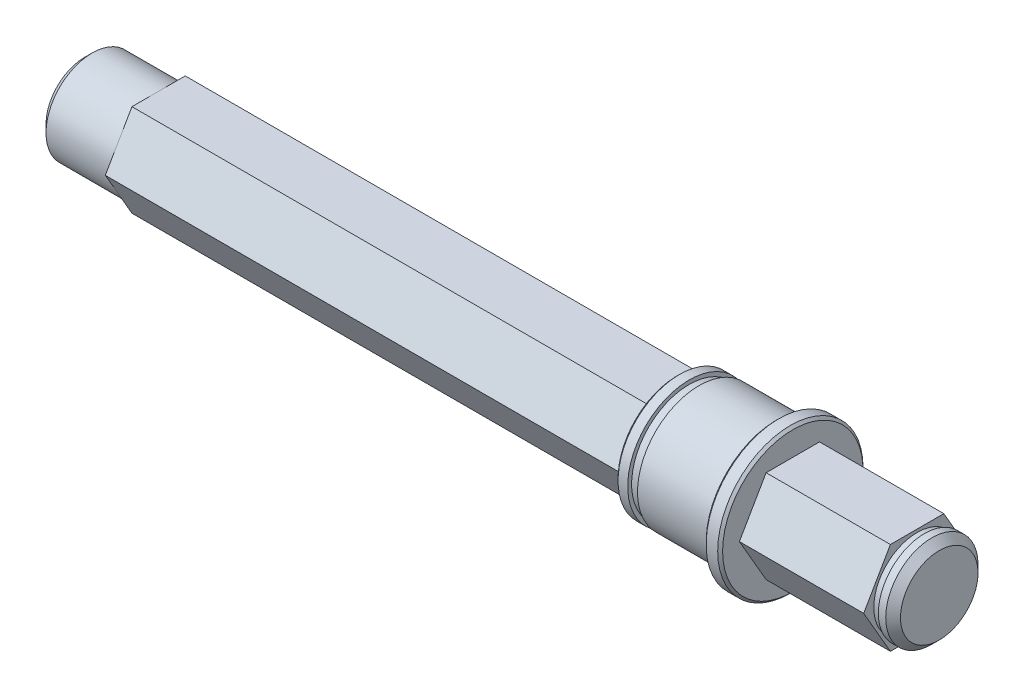
ISO-10303-21;
HEADER;
FILE_DESCRIPTION(('STEP AP214'),'2;1');
FILE_NAME('part.step','',(''),(''),'','','');
FILE_SCHEMA(('AUTOMOTIVE_DESIGN { 1 0 10303 214 1 1 1 1 }'));
ENDSEC;
DATA;
#1=APPLICATION_CONTEXT('core data for automotive mechanical design processes');
#2=APPLICATION_PROTOCOL_DEFINITION('international standard','automotive_design',2000,#1);
#3=PRODUCT_CONTEXT('',#1,'mechanical');
#4=PRODUCT('Part','Part','',(#3));
#5=PRODUCT_RELATED_PRODUCT_CATEGORY('part','',(#4));
#6=PRODUCT_DEFINITION_FORMATION('','',#4);
#7=PRODUCT_DEFINITION_CONTEXT('part definition',#1,'design');
#8=PRODUCT_DEFINITION('design','',#6,#7);
#9=PRODUCT_DEFINITION_SHAPE('','',#8);
#10=(LENGTH_UNIT() NAMED_UNIT(*) SI_UNIT(.MILLI.,.METRE.));
#11=(NAMED_UNIT(*) PLANE_ANGLE_UNIT() SI_UNIT($,.RADIAN.));
#12=(NAMED_UNIT(*) SI_UNIT($,.STERADIAN.) SOLID_ANGLE_UNIT());
#13=UNCERTAINTY_MEASURE_WITH_UNIT(LENGTH_MEASURE(1.E-05),#10,'distance_accuracy_value','');
#14=(GEOMETRIC_REPRESENTATION_CONTEXT(3) GLOBAL_UNCERTAINTY_ASSIGNED_CONTEXT((#13)) GLOBAL_UNIT_ASSIGNED_CONTEXT((#10,
#11,#12)) REPRESENTATION_CONTEXT('',''));
#15=CARTESIAN_POINT('',(0.,0.,0.));
#16=DIRECTION('',(0.,0.,1.));
#17=DIRECTION('',(1.,0.,0.));
#18=AXIS2_PLACEMENT_3D('',#15,#16,#17);
#19=CARTESIAN_POINT('',(15.113,0.,0.));
#20=DIRECTION('',(1.,0.,0.));
#21=DIRECTION('',(0.,0.,-1.));
#22=AXIS2_PLACEMENT_3D('',#19,#20,#21);
#23=PLANE('',#22);
#24=CARTESIAN_POINT('',(15.1129999999853,0.,0.));
#25=DIRECTION('',(-1.,0.,0.));
#26=DIRECTION('',(0.,-1.,0.));
#27=AXIS2_PLACEMENT_3D('',#24,#25,#26);
#28=CIRCLE('',#27,4.00050000001784);
#29=CARTESIAN_POINT('',(15.1129999999853,-4.00050000001784,0.));
#30=VERTEX_POINT('',#29);
#31=EDGE_CURVE('E20',#30,#30,#28,.T.);
#32=ORIENTED_EDGE('',*,*,#31,.F.);
#33=EDGE_LOOP('',(#32));
#34=FACE_BOUND('',#33,.T.);
#35=ADVANCED_FACE('F17',(#34),#23,.T.);
#36=CARTESIAN_POINT('',(14.3510000000333,0.,0.));
#37=DIRECTION('',(-1.,0.,0.));
#38=DIRECTION('',(0.,-1.,0.));
#39=AXIS2_PLACEMENT_3D('',#36,#37,#38);
#40=CONICAL_SURFACE('',#39,4.7624999999698,0.785398163397448);
#41=ORIENTED_EDGE('',*,*,#31,.T.);
#42=EDGE_LOOP('',(#41));
#43=FACE_BOUND('',#42,.T.);
#44=CARTESIAN_POINT('',(14.3510000000001,0.,0.));
#45=DIRECTION('',(-1.,0.,0.));
#46=DIRECTION('',(0.,0.,1.));
#47=AXIS2_PLACEMENT_3D('',#44,#45,#46);
#48=CIRCLE('',#47,4.7625);
#49=CARTESIAN_POINT('',(14.3510000000001,0.,4.7625));
#50=VERTEX_POINT('',#49);
#51=EDGE_CURVE('E234',#50,#50,#48,.T.);
#52=ORIENTED_EDGE('',*,*,#51,.F.);
#53=EDGE_LOOP('',(#52));
#54=FACE_BOUND('',#53,.T.);
#55=ADVANCED_FACE('F668',(#43,#54),#40,.T.);
#56=CARTESIAN_POINT('',(15.113,0.,0.));
#57=DIRECTION('',(-1.,0.,0.));
#58=DIRECTION('',(0.,0.,1.));
#59=AXIS2_PLACEMENT_3D('',#56,#57,#58);
#60=CYLINDRICAL_SURFACE('',#59,4.7625);
#61=ORIENTED_EDGE('',*,*,#51,.T.);
#62=EDGE_LOOP('',(#61));
#63=FACE_BOUND('',#62,.T.);
#64=CARTESIAN_POINT('',(13.589,0.,0.));
#65=DIRECTION('',(-1.,0.,0.));
#66=DIRECTION('',(0.,0.,1.));
#67=AXIS2_PLACEMENT_3D('',#64,#65,#66);
#68=CIRCLE('',#67,4.7625);
#69=CARTESIAN_POINT('',(13.589,0.,4.7625));
#70=VERTEX_POINT('',#69);
#71=EDGE_CURVE('E237',#70,#70,#68,.F.);
#72=ORIENTED_EDGE('',*,*,#71,.T.);
#73=EDGE_LOOP('',(#72));
#74=FACE_BOUND('',#73,.T.);
#75=ADVANCED_FACE('F280',(#63,#74),#60,.T.);
#76=CARTESIAN_POINT('',(13.589,0.,0.));
#77=DIRECTION('',(1.,0.,0.));
#78=DIRECTION('',(0.,0.,-1.));
#79=AXIS2_PLACEMENT_3D('',#76,#77,#78);
#80=PLANE('',#79);
#81=ORIENTED_EDGE('',*,*,#71,.F.);
#82=EDGE_LOOP('',(#81));
#83=FACE_BOUND('',#82,.T.);
#84=CARTESIAN_POINT('',(13.589,0.,0.));
#85=DIRECTION('',(-1.,0.,0.));
#86=DIRECTION('',(0.,0.,1.));
#87=AXIS2_PLACEMENT_3D('',#84,#85,#86);
#88=CIRCLE('',#87,4.4704);
#89=CARTESIAN_POINT('',(13.589,0.,4.4704));
#90=VERTEX_POINT('',#89);
#91=EDGE_CURVE('E275',#90,#90,#88,.T.);
#92=ORIENTED_EDGE('',*,*,#91,.F.);
#93=EDGE_LOOP('',(#92));
#94=FACE_BOUND('',#93,.T.);
#95=ADVANCED_FACE('F282',(#83,#94),#80,.F.);
#96=CARTESIAN_POINT('',(13.589,0.,0.));
#97=DIRECTION('',(-1.,0.,0.));
#98=DIRECTION('',(0.,0.,1.));
#99=AXIS2_PLACEMENT_3D('',#96,#97,#98);
#100=CYLINDRICAL_SURFACE('',#99,4.4704);
#101=CARTESIAN_POINT('',(12.827,0.,0.));
#102=DIRECTION('',(-1.,0.,0.));
#103=DIRECTION('',(0.,0.,1.));
#104=AXIS2_PLACEMENT_3D('',#101,#102,#103);
#105=CIRCLE('',#104,4.4704);
#106=CARTESIAN_POINT('',(12.827,0.,4.4704));
#107=VERTEX_POINT('',#106);
#108=EDGE_CURVE('E233',#107,#107,#105,.T.);
#109=ORIENTED_EDGE('',*,*,#108,.F.);
#110=EDGE_LOOP('',(#109));
#111=FACE_BOUND('',#110,.T.);
#112=ORIENTED_EDGE('',*,*,#91,.T.);
#113=EDGE_LOOP('',(#112));
#114=FACE_BOUND('',#113,.T.);
#115=ADVANCED_FACE('F285',(#111,#114),#100,.T.);
#116=CARTESIAN_POINT('',(12.827,0.,0.));
#117=DIRECTION('',(1.,0.,0.));
#118=DIRECTION('',(0.,0.,-1.));
#119=AXIS2_PLACEMENT_3D('',#116,#117,#118);
#120=PLANE('',#119);
#121=DIRECTION('',(0.,0.866025403784438,0.500000000000001));
#122=VECTOR('',#121,1.);
#123=CARTESIAN_POINT('',(12.827,0.,5.5139260108686));
#124=LINE('',#123,#122);
#125=CARTESIAN_POINT('',(12.827,0.,5.5139260108686));
#126=VERTEX_POINT('',#125);
#127=CARTESIAN_POINT('',(12.827,-4.7752,2.7569630054343));
#128=VERTEX_POINT('',#127);
#129=EDGE_CURVE('E216',#126,#128,#124,.F.);
#130=ORIENTED_EDGE('',*,*,#129,.T.);
#131=DIRECTION('',(0.,0.,1.));
#132=VECTOR('',#131,1.);
#133=CARTESIAN_POINT('',(12.827,-4.7752,2.7569630054343));
#134=LINE('',#133,#132);
#135=CARTESIAN_POINT('',(12.827,-4.7752,-2.7569630054343));
#136=VERTEX_POINT('',#135);
#137=EDGE_CURVE('E222',#128,#136,#134,.F.);
#138=ORIENTED_EDGE('',*,*,#137,.T.);
#139=DIRECTION('',(0.,-0.866025403784439,0.5));
#140=VECTOR('',#139,1.);
#141=CARTESIAN_POINT('',(12.827,-4.7752,-2.7569630054343));
#142=LINE('',#141,#140);
#143=CARTESIAN_POINT('',(12.827,0.,-5.5139260108686));
#144=VERTEX_POINT('',#143);
#145=EDGE_CURVE('E228',#136,#144,#142,.F.);
#146=ORIENTED_EDGE('',*,*,#145,.T.);
#147=DIRECTION('',(0.,-0.866025403784439,-0.5));
#148=VECTOR('',#147,1.);
#149=CARTESIAN_POINT('',(12.827,0.,-5.5139260108686));
#150=LINE('',#149,#148);
#151=CARTESIAN_POINT('',(12.827,4.7752,-2.7569630054343));
#152=VERTEX_POINT('',#151);
#153=EDGE_CURVE('E231',#144,#152,#150,.F.);
#154=ORIENTED_EDGE('',*,*,#153,.T.);
#155=DIRECTION('',(0.,0.,-1.));
#156=VECTOR('',#155,1.);
#157=CARTESIAN_POINT('',(12.827,4.7752,-2.7569630054343));
#158=LINE('',#157,#156);
#159=CARTESIAN_POINT('',(12.827,4.7752,2.7569630054343));
#160=VERTEX_POINT('',#159);
#161=EDGE_CURVE('E201',#152,#160,#158,.F.);
#162=ORIENTED_EDGE('',*,*,#161,.T.);
#163=DIRECTION('',(0.,0.866025403784439,-0.5));
#164=VECTOR('',#163,1.);
#165=CARTESIAN_POINT('',(12.827,4.7752,2.7569630054343));
#166=LINE('',#165,#164);
#167=EDGE_CURVE('E210',#160,#126,#166,.F.);
#168=ORIENTED_EDGE('',*,*,#167,.T.);
#169=EDGE_LOOP('',(#130,#138,#146,#154,#162,#168));
#170=FACE_BOUND('',#169,.T.);
#171=ORIENTED_EDGE('',*,*,#108,.T.);
#172=EDGE_LOOP('',(#171));
#173=FACE_BOUND('',#172,.T.);
#174=ADVANCED_FACE('F290',(#170,#173),#120,.T.);
#175=CARTESIAN_POINT('',(12.827,0.,-5.5139260108686));
#176=DIRECTION('',(0.,-0.5,0.866025403784439));
#177=DIRECTION('',(0.,-0.866025403784439,-0.5));
#178=AXIS2_PLACEMENT_3D('',#175,#176,#177);
#179=PLANE('',#178);
#180=DIRECTION('',(1.,0.,0.));
#181=VECTOR('',#180,1.);
#182=CARTESIAN_POINT('',(12.827,4.7752,-2.7569630054343));
#183=LINE('',#182,#181);
#184=CARTESIAN_POINT('',(0.,4.7752,-2.7569630054343));
#185=VERTEX_POINT('',#184);
#186=EDGE_CURVE('E204',#185,#152,#183,.T.);
#187=ORIENTED_EDGE('',*,*,#186,.T.);
#188=ORIENTED_EDGE('',*,*,#153,.F.);
#189=DIRECTION('',(1.,0.,0.));
#190=VECTOR('',#189,1.);
#191=CARTESIAN_POINT('',(12.827,0.,-5.5139260108686));
#192=LINE('',#191,#190);
#193=CARTESIAN_POINT('',(0.,0.,-5.5139260108686));
#194=VERTEX_POINT('',#193);
#195=EDGE_CURVE('E225',#144,#194,#192,.F.);
#196=ORIENTED_EDGE('',*,*,#195,.T.);
#197=DIRECTION('',(0.,-0.866025403784438,-0.5));
#198=VECTOR('',#197,1.);
#199=CARTESIAN_POINT('',(0.,4.7752,-2.7569630054343));
#200=LINE('',#199,#198);
#201=EDGE_CURVE('E196',#185,#194,#200,.T.);
#202=ORIENTED_EDGE('',*,*,#201,.F.);
#203=EDGE_LOOP('',(#187,#188,#196,#202));
#204=FACE_BOUND('',#203,.T.);
#205=ADVANCED_FACE('F297',(#204),#179,.F.);
#206=CARTESIAN_POINT('',(12.827,-4.7752,-2.7569630054343));
#207=DIRECTION('',(0.,0.5,0.866025403784439));
#208=DIRECTION('',(0.,-0.866025403784439,0.5));
#209=AXIS2_PLACEMENT_3D('',#206,#207,#208);
#210=PLANE('',#209);
#211=ORIENTED_EDGE('',*,*,#195,.F.);
#212=ORIENTED_EDGE('',*,*,#145,.F.);
#213=DIRECTION('',(1.,0.,0.));
#214=VECTOR('',#213,1.);
#215=CARTESIAN_POINT('',(12.827,-4.7752,-2.7569630054343));
#216=LINE('',#215,#214);
#217=CARTESIAN_POINT('',(0.,-4.7752,-2.7569630054343));
#218=VERTEX_POINT('',#217);
#219=EDGE_CURVE('E219',#136,#218,#216,.F.);
#220=ORIENTED_EDGE('',*,*,#219,.T.);
#221=DIRECTION('',(0.,-0.866025403784439,0.499999999999999));
#222=VECTOR('',#221,1.);
#223=CARTESIAN_POINT('',(0.,0.,-5.5139260108686));
#224=LINE('',#223,#222);
#225=EDGE_CURVE('E194',#194,#218,#224,.T.);
#226=ORIENTED_EDGE('',*,*,#225,.F.);
#227=EDGE_LOOP('',(#211,#212,#220,#226));
#228=FACE_BOUND('',#227,.T.);
#229=ADVANCED_FACE('F419',(#228),#210,.F.);
#230=CARTESIAN_POINT('',(12.827,-4.7752,2.7569630054343));
#231=DIRECTION('',(0.,1.,0.));
#232=DIRECTION('',(0.,0.,1.));
#233=AXIS2_PLACEMENT_3D('',#230,#231,#232);
#234=PLANE('',#233);
#235=ORIENTED_EDGE('',*,*,#219,.F.);
#236=ORIENTED_EDGE('',*,*,#137,.F.);
#237=DIRECTION('',(1.,0.,0.));
#238=VECTOR('',#237,1.);
#239=CARTESIAN_POINT('',(12.827,-4.7752,2.7569630054343));
#240=LINE('',#239,#238);
#241=CARTESIAN_POINT('',(0.,-4.7752,2.7569630054343));
#242=VERTEX_POINT('',#241);
#243=EDGE_CURVE('E213',#128,#242,#240,.F.);
#244=ORIENTED_EDGE('',*,*,#243,.T.);
#245=DIRECTION('',(0.,0.,-1.));
#246=VECTOR('',#245,1.);
#247=CARTESIAN_POINT('',(0.,-4.7752,0.));
#248=LINE('',#247,#246);
#249=EDGE_CURVE('E192',#218,#242,#248,.F.);
#250=ORIENTED_EDGE('',*,*,#249,.F.);
#251=EDGE_LOOP('',(#235,#236,#244,#250));
#252=FACE_BOUND('',#251,.T.);
#253=ADVANCED_FACE('F415',(#252),#234,.F.);
#254=CARTESIAN_POINT('',(12.827,0.,5.5139260108686));
#255=DIRECTION('',(0.,0.500000000000001,-0.866025403784438));
#256=DIRECTION('',(0.,0.866025403784438,0.500000000000001));
#257=AXIS2_PLACEMENT_3D('',#254,#255,#256);
#258=PLANE('',#257);
#259=ORIENTED_EDGE('',*,*,#243,.F.);
#260=ORIENTED_EDGE('',*,*,#129,.F.);
#261=DIRECTION('',(1.,0.,0.));
#262=VECTOR('',#261,1.);
#263=CARTESIAN_POINT('',(12.827,0.,5.5139260108686));
#264=LINE('',#263,#262);
#265=CARTESIAN_POINT('',(0.,0.,5.5139260108686));
#266=VERTEX_POINT('',#265);
#267=EDGE_CURVE('E207',#126,#266,#264,.F.);
#268=ORIENTED_EDGE('',*,*,#267,.T.);
#269=DIRECTION('',(0.,0.866025403784438,0.5));
#270=VECTOR('',#269,1.);
#271=CARTESIAN_POINT('',(0.,-4.7752,2.7569630054343));
#272=LINE('',#271,#270);
#273=EDGE_CURVE('E190',#242,#266,#272,.T.);
#274=ORIENTED_EDGE('',*,*,#273,.F.);
#275=EDGE_LOOP('',(#259,#260,#268,#274));
#276=FACE_BOUND('',#275,.T.);
#277=ADVANCED_FACE('F411',(#276),#258,.F.);
#278=CARTESIAN_POINT('',(12.827,4.7752,2.7569630054343));
#279=DIRECTION('',(0.,-0.5,-0.866025403784439));
#280=DIRECTION('',(0.,0.866025403784439,-0.5));
#281=AXIS2_PLACEMENT_3D('',#278,#279,#280);
#282=PLANE('',#281);
#283=ORIENTED_EDGE('',*,*,#267,.F.);
#284=ORIENTED_EDGE('',*,*,#167,.F.);
#285=DIRECTION('',(1.,0.,0.));
#286=VECTOR('',#285,1.);
#287=CARTESIAN_POINT('',(12.827,4.7752,2.7569630054343));
#288=LINE('',#287,#286);
#289=CARTESIAN_POINT('',(0.,4.7752,2.7569630054343));
#290=VERTEX_POINT('',#289);
#291=EDGE_CURVE('E198',#160,#290,#288,.F.);
#292=ORIENTED_EDGE('',*,*,#291,.T.);
#293=DIRECTION('',(0.,0.866025403784439,-0.5));
#294=VECTOR('',#293,1.);
#295=CARTESIAN_POINT('',(0.,0.,5.5139260108686));
#296=LINE('',#295,#294);
#297=EDGE_CURVE('E188',#266,#290,#296,.T.);
#298=ORIENTED_EDGE('',*,*,#297,.F.);
#299=EDGE_LOOP('',(#283,#284,#292,#298));
#300=FACE_BOUND('',#299,.T.);
#301=ADVANCED_FACE('F407',(#300),#282,.F.);
#302=CARTESIAN_POINT('',(12.827,4.7752,-2.7569630054343));
#303=DIRECTION('',(0.,-1.,0.));
#304=DIRECTION('',(0.,0.,-1.));
#305=AXIS2_PLACEMENT_3D('',#302,#303,#304);
#306=PLANE('',#305);
#307=ORIENTED_EDGE('',*,*,#291,.F.);
#308=ORIENTED_EDGE('',*,*,#161,.F.);
#309=ORIENTED_EDGE('',*,*,#186,.F.);
#310=DIRECTION('',(0.,0.,-1.));
#311=VECTOR('',#310,1.);
#312=CARTESIAN_POINT('',(0.,4.7752,0.));
#313=LINE('',#312,#311);
#314=EDGE_CURVE('E185',#290,#185,#313,.T.);
#315=ORIENTED_EDGE('',*,*,#314,.F.);
#316=EDGE_LOOP('',(#307,#308,#309,#315));
#317=FACE_BOUND('',#316,.T.);
#318=ADVANCED_FACE('F403',(#317),#306,.F.);
#319=CARTESIAN_POINT('',(0.,0.,0.));
#320=DIRECTION('',(1.,0.,0.));
#321=DIRECTION('',(0.,0.,-1.));
#322=AXIS2_PLACEMENT_3D('',#319,#320,#321);
#323=PLANE('',#322);
#324=ORIENTED_EDGE('',*,*,#297,.T.);
#325=ORIENTED_EDGE('',*,*,#314,.T.);
#326=ORIENTED_EDGE('',*,*,#201,.T.);
#327=ORIENTED_EDGE('',*,*,#225,.T.);
#328=ORIENTED_EDGE('',*,*,#249,.T.);
#329=ORIENTED_EDGE('',*,*,#273,.T.);
#330=EDGE_LOOP('',(#324,#325,#326,#327,#328,#329));
#331=FACE_BOUND('',#330,.T.);
#332=CARTESIAN_POINT('',(0.,0.,0.));
#333=DIRECTION('',(-1.,0.,0.));
#334=DIRECTION('',(0.,0.,1.));
#335=AXIS2_PLACEMENT_3D('',#332,#333,#334);
#336=CIRCLE('',#335,7.24599999999997);
#337=CARTESIAN_POINT('',(0.,0.,7.24599999999997));
#338=VERTEX_POINT('',#337);
#339=EDGE_CURVE('E184',#338,#338,#336,.T.);
#340=ORIENTED_EDGE('',*,*,#339,.F.);
#341=EDGE_LOOP('',(#340));
#342=FACE_BOUND('',#341,.T.);
#343=ADVANCED_FACE('F399',(#331,#342),#323,.T.);
#344=CARTESIAN_POINT('',(-0.254000000000023,0.,0.));
#345=DIRECTION('',(-1.,0.,0.));
#346=DIRECTION('',(0.,0.,1.));
#347=AXIS2_PLACEMENT_3D('',#344,#345,#346);
#348=CONICAL_SURFACE('',#347,7.5,0.785398163397453);
#349=ORIENTED_EDGE('',*,*,#339,.T.);
#350=EDGE_LOOP('',(#349));
#351=FACE_BOUND('',#350,.T.);
#352=CARTESIAN_POINT('',(-0.254000000000023,0.,0.));
#353=DIRECTION('',(1.,0.,0.));
#354=DIRECTION('',(0.,0.,-1.));
#355=AXIS2_PLACEMENT_3D('',#352,#353,#354);
#356=CIRCLE('',#355,7.5);
#357=CARTESIAN_POINT('',(-0.254000000000023,0.,-7.5));
#358=VERTEX_POINT('',#357);
#359=EDGE_CURVE('E181',#358,#358,#356,.F.);
#360=ORIENTED_EDGE('',*,*,#359,.F.);
#361=EDGE_LOOP('',(#360));
#362=FACE_BOUND('',#361,.T.);
#363=ADVANCED_FACE('F395',(#351,#362),#348,.T.);
#364=CARTESIAN_POINT('',(-1.7018,0.,0.));
#365=DIRECTION('',(1.,0.,0.));
#366=DIRECTION('',(0.,0.,-1.));
#367=AXIS2_PLACEMENT_3D('',#364,#365,#366);
#368=CYLINDRICAL_SURFACE('',#367,7.5);
#369=CARTESIAN_POINT('',(-1.4478,0.,0.));
#370=DIRECTION('',(1.,0.,0.));
#371=DIRECTION('',(0.,0.,-1.));
#372=AXIS2_PLACEMENT_3D('',#369,#370,#371);
#373=CIRCLE('',#372,7.5);
#374=CARTESIAN_POINT('',(-1.4478,0.,-7.5));
#375=VERTEX_POINT('',#374);
#376=EDGE_CURVE('E177',#375,#375,#373,.F.);
#377=ORIENTED_EDGE('',*,*,#376,.F.);
#378=EDGE_LOOP('',(#377));
#379=FACE_BOUND('',#378,.T.);
#380=ORIENTED_EDGE('',*,*,#359,.T.);
#381=EDGE_LOOP('',(#380));
#382=FACE_BOUND('',#381,.T.);
#383=ADVANCED_FACE('F391',(#379,#382),#368,.T.);
#384=CARTESIAN_POINT('',(-1.4478,0.,0.));
#385=DIRECTION('',(1.,0.,0.));
#386=DIRECTION('',(0.,0.,-1.));
#387=AXIS2_PLACEMENT_3D('',#384,#385,#386);
#388=CONICAL_SURFACE('',#387,7.5,0.785398163397445);
#389=CARTESIAN_POINT('',(-1.7018,0.,0.));
#390=DIRECTION('',(1.,0.,0.));
#391=DIRECTION('',(0.,0.,-1.));
#392=AXIS2_PLACEMENT_3D('',#389,#390,#391);
#393=CIRCLE('',#392,7.246);
#394=CARTESIAN_POINT('',(-1.7018,0.,-7.246));
#395=VERTEX_POINT('',#394);
#396=EDGE_CURVE('E180',#395,#395,#393,.T.);
#397=ORIENTED_EDGE('',*,*,#396,.T.);
#398=EDGE_LOOP('',(#397));
#399=FACE_BOUND('',#398,.T.);
#400=ORIENTED_EDGE('',*,*,#376,.T.);
#401=EDGE_LOOP('',(#400));
#402=FACE_BOUND('',#401,.T.);
#403=ADVANCED_FACE('F387',(#399,#402),#388,.T.);
#404=CARTESIAN_POINT('',(-1.7018,0.,0.));
#405=DIRECTION('',(1.,0.,0.));
#406=DIRECTION('',(0.,0.,-1.));
#407=AXIS2_PLACEMENT_3D('',#404,#405,#406);
#408=PLANE('',#407);
#409=CARTESIAN_POINT('',(-1.7018,0.,0.));
#410=DIRECTION('',(1.,0.,0.));
#411=DIRECTION('',(0.,0.,-1.));
#412=AXIS2_PLACEMENT_3D('',#409,#410,#411);
#413=CIRCLE('',#412,6.35);
#414=CARTESIAN_POINT('',(-1.7018,0.,-6.35));
#415=VERTEX_POINT('',#414);
#416=EDGE_CURVE('E266',#415,#415,#413,.F.);
#417=ORIENTED_EDGE('',*,*,#416,.F.);
#418=EDGE_LOOP('',(#417));
#419=FACE_BOUND('',#418,.T.);
#420=ORIENTED_EDGE('',*,*,#396,.F.);
#421=EDGE_LOOP('',(#420));
#422=FACE_BOUND('',#421,.T.);
#423=ADVANCED_FACE('F383',(#419,#422),#408,.F.);
#424=CARTESIAN_POINT('',(-11.938,0.,0.));
#425=DIRECTION('',(1.,0.,0.));
#426=DIRECTION('',(0.,0.,-1.));
#427=AXIS2_PLACEMENT_3D('',#424,#425,#426);
#428=CYLINDRICAL_SURFACE('',#427,6.35);
#429=CARTESIAN_POINT('',(-9.6774,0.,0.));
#430=DIRECTION('',(1.,0.,0.));
#431=DIRECTION('',(0.,0.,-1.));
#432=AXIS2_PLACEMENT_3D('',#429,#430,#431);
#433=CIRCLE('',#432,6.35);
#434=CARTESIAN_POINT('',(-9.6774,0.,-6.35));
#435=VERTEX_POINT('',#434);
#436=EDGE_CURVE('E263',#435,#435,#433,.T.);
#437=ORIENTED_EDGE('',*,*,#436,.T.);
#438=EDGE_LOOP('',(#437));
#439=FACE_BOUND('',#438,.T.);
#440=ORIENTED_EDGE('',*,*,#416,.T.);
#441=EDGE_LOOP('',(#440));
#442=FACE_BOUND('',#441,.T.);
#443=ADVANCED_FACE('F379',(#439,#442),#428,.T.);
#444=CARTESIAN_POINT('',(-9.6774,0.,-7.5));
#445=DIRECTION('',(1.,0.,0.));
#446=DIRECTION('',(0.,0.,-1.));
#447=AXIS2_PLACEMENT_3D('',#444,#445,#446);
#448=PLANE('',#447);
#449=CARTESIAN_POINT('',(-9.6774,0.,0.));
#450=DIRECTION('',(1.,0.,0.));
#451=DIRECTION('',(0.,0.,-1.));
#452=AXIS2_PLACEMENT_3D('',#449,#450,#451);
#453=CIRCLE('',#452,5.9436);
#454=CARTESIAN_POINT('',(-9.6774,0.,-5.9436));
#455=VERTEX_POINT('',#454);
#456=EDGE_CURVE('E260',#455,#455,#453,.F.);
#457=ORIENTED_EDGE('',*,*,#456,.F.);
#458=EDGE_LOOP('',(#457));
#459=FACE_BOUND('',#458,.T.);
#460=ORIENTED_EDGE('',*,*,#436,.F.);
#461=EDGE_LOOP('',(#460));
#462=FACE_BOUND('',#461,.T.);
#463=ADVANCED_FACE('F375',(#459,#462),#448,.F.);
#464=CARTESIAN_POINT('',(0.,0.,0.));
#465=DIRECTION('',(1.,0.,0.));
#466=DIRECTION('',(0.,0.,-1.));
#467=AXIS2_PLACEMENT_3D('',#464,#465,#466);
#468=CYLINDRICAL_SURFACE('',#467,5.9436);
#469=ORIENTED_EDGE('',*,*,#456,.T.);
#470=EDGE_LOOP('',(#469));
#471=FACE_BOUND('',#470,.T.);
#472=CARTESIAN_POINT('',(-10.6934,0.,0.));
#473=DIRECTION('',(1.,0.,0.));
#474=DIRECTION('',(0.,0.,-1.));
#475=AXIS2_PLACEMENT_3D('',#472,#473,#474);
#476=CIRCLE('',#475,5.9436);
#477=CARTESIAN_POINT('',(-10.6934,0.,-5.9436));
#478=VERTEX_POINT('',#477);
#479=EDGE_CURVE('E257',#478,#478,#476,.T.);
#480=ORIENTED_EDGE('',*,*,#479,.T.);
#481=EDGE_LOOP('',(#480));
#482=FACE_BOUND('',#481,.T.);
#483=ADVANCED_FACE('F371',(#471,#482),#468,.T.);
#484=CARTESIAN_POINT('',(-10.6934,0.,-7.5));
#485=DIRECTION('',(-1.,0.,0.));
#486=DIRECTION('',(0.,0.,1.));
#487=AXIS2_PLACEMENT_3D('',#484,#485,#486);
#488=PLANE('',#487);
#489=ORIENTED_EDGE('',*,*,#479,.F.);
#490=EDGE_LOOP('',(#489));
#491=FACE_BOUND('',#490,.T.);
#492=CARTESIAN_POINT('',(-10.6934,0.,0.));
#493=DIRECTION('',(1.,0.,0.));
#494=DIRECTION('',(0.,0.,-1.));
#495=AXIS2_PLACEMENT_3D('',#492,#493,#494);
#496=CIRCLE('',#495,6.35);
#497=CARTESIAN_POINT('',(-10.6934,0.,-6.35));
#498=VERTEX_POINT('',#497);
#499=EDGE_CURVE('E254',#498,#498,#496,.F.);
#500=ORIENTED_EDGE('',*,*,#499,.F.);
#501=EDGE_LOOP('',(#500));
#502=FACE_BOUND('',#501,.T.);
#503=ADVANCED_FACE('F367',(#491,#502),#488,.F.);
#504=CARTESIAN_POINT('',(-73.0758,0.,0.));
#505=DIRECTION('',(-1.,0.,0.));
#506=DIRECTION('',(0.,0.,1.));
#507=AXIS2_PLACEMENT_3D('',#504,#505,#506);
#508=PLANE('',#507);
#509=CARTESIAN_POINT('',(-73.0757999999696,0.,0.));
#510=DIRECTION('',(1.,0.,0.));
#511=DIRECTION('',(0.,0.,-1.));
#512=AXIS2_PLACEMENT_3D('',#509,#510,#511);
#513=CIRCLE('',#512,4.00050000001784);
#514=CARTESIAN_POINT('',(-73.0757999999696,0.,-4.00050000001784));
#515=VERTEX_POINT('',#514);
#516=EDGE_CURVE('E143',#515,#515,#513,.T.);
#517=ORIENTED_EDGE('',*,*,#516,.F.);
#518=EDGE_LOOP('',(#517));
#519=FACE_BOUND('',#518,.T.);
#520=ADVANCED_FACE('F363',(#519),#508,.T.);
#521=CARTESIAN_POINT('',(-11.938,0.,0.));
#522=DIRECTION('',(1.,0.,0.));
#523=DIRECTION('',(0.,0.,-1.));
#524=AXIS2_PLACEMENT_3D('',#521,#522,#523);
#525=CYLINDRICAL_SURFACE('',#524,6.35);
#526=CARTESIAN_POINT('',(-11.6840000000025,0.,0.));
#527=DIRECTION('',(1.,0.,0.));
#528=DIRECTION('',(0.,0.,-1.));
#529=AXIS2_PLACEMENT_3D('',#526,#527,#528);
#530=CIRCLE('',#529,6.35000000005448);
#531=CARTESIAN_POINT('',(-11.6840000000025,0.,-6.35000000005448));
#532=VERTEX_POINT('',#531);
#533=EDGE_CURVE('E172',#532,#532,#530,.F.);
#534=ORIENTED_EDGE('',*,*,#533,.F.);
#535=EDGE_LOOP('',(#534));
#536=FACE_BOUND('',#535,.T.);
#537=ORIENTED_EDGE('',*,*,#499,.T.);
#538=EDGE_LOOP('',(#537));
#539=FACE_BOUND('',#538,.T.);
#540=ADVANCED_FACE('F360',(#536,#539),#525,.T.);
#541=CARTESIAN_POINT('',(-65.4558,0.,0.));
#542=DIRECTION('',(-1.,0.,0.));
#543=DIRECTION('',(0.,0.,1.));
#544=AXIS2_PLACEMENT_3D('',#541,#542,#543);
#545=PLANE('',#544);
#546=CARTESIAN_POINT('',(-65.4558,0.,0.));
#547=DIRECTION('',(-1.,0.,0.));
#548=DIRECTION('',(0.,0.,1.));
#549=AXIS2_PLACEMENT_3D('',#546,#547,#548);
#550=CIRCLE('',#549,4.7625);
#551=CARTESIAN_POINT('',(-65.4558,4.7625,0.));
#552=VERTEX_POINT('',#551);
#553=CARTESIAN_POINT('',(-65.4558,2.38125,-4.12444598552339));
#554=VERTEX_POINT('',#553);
#555=EDGE_CURVE('E121',#552,#554,#550,.T.);
#556=ORIENTED_EDGE('',*,*,#555,.F.);
#557=DIRECTION('',(0.,0.,-1.));
#558=VECTOR('',#557,1.);
#559=CARTESIAN_POINT('',(-65.4558,4.7625,2.74963065701559));
#560=LINE('',#559,#558);
#561=CARTESIAN_POINT('',(-65.4558,4.7625,-2.74963065701559));
#562=VERTEX_POINT('',#561);
#563=EDGE_CURVE('E148',#552,#562,#560,.T.);
#564=ORIENTED_EDGE('',*,*,#563,.T.);
#565=DIRECTION('',(0.,-0.866025403784439,-0.5));
#566=VECTOR('',#565,1.);
#567=CARTESIAN_POINT('',(-65.4558,4.7625,-2.74963065701559));
#568=LINE('',#567,#566);
#569=EDGE_CURVE('E146',#562,#554,#568,.T.);
#570=ORIENTED_EDGE('',*,*,#569,.T.);
#571=EDGE_LOOP('',(#556,#564,#570));
#572=FACE_BOUND('',#571,.T.);
#573=ADVANCED_FACE('F147',(#572),#545,.T.);
#574=CARTESIAN_POINT('',(-65.4558,0.,0.));
#575=DIRECTION('',(-1.,0.,0.));
#576=DIRECTION('',(0.,0.,1.));
#577=AXIS2_PLACEMENT_3D('',#574,#575,#576);
#578=PLANE('',#577);
#579=CARTESIAN_POINT('',(-65.4558,0.,0.));
#580=DIRECTION('',(-1.,0.,0.));
#581=DIRECTION('',(0.,0.,1.));
#582=AXIS2_PLACEMENT_3D('',#579,#580,#581);
#583=CIRCLE('',#582,4.7625);
#584=CARTESIAN_POINT('',(-65.4558,-2.38125,-4.12444598552339));
#585=VERTEX_POINT('',#584);
#586=EDGE_CURVE('E126',#554,#585,#583,.T.);
#587=ORIENTED_EDGE('',*,*,#586,.F.);
#588=DIRECTION('',(0.,-0.866025403784439,-0.5));
#589=VECTOR('',#588,1.);
#590=CARTESIAN_POINT('',(-65.4558,4.7625,-2.74963065701559));
#591=LINE('',#590,#589);
#592=CARTESIAN_POINT('',(-65.4558,0.,-5.49926131403118));
#593=VERTEX_POINT('',#592);
#594=EDGE_CURVE('E129',#554,#593,#591,.T.);
#595=ORIENTED_EDGE('',*,*,#594,.T.);
#596=DIRECTION('',(0.,-0.866025403784439,0.5));
#597=VECTOR('',#596,1.);
#598=CARTESIAN_POINT('',(-65.4558,0.,-5.49926131403118));
#599=LINE('',#598,#597);
#600=EDGE_CURVE('E131',#593,#585,#599,.T.);
#601=ORIENTED_EDGE('',*,*,#600,.T.);
#602=EDGE_LOOP('',(#587,#595,#601));
#603=FACE_BOUND('',#602,.T.);
#604=ADVANCED_FACE('F127',(#603),#578,.T.);
#605=CARTESIAN_POINT('',(-72.3138000000176,0.,0.));
#606=DIRECTION('',(1.,0.,0.));
#607=DIRECTION('',(0.,0.,-1.));
#608=AXIS2_PLACEMENT_3D('',#605,#606,#607);
#609=CONICAL_SURFACE('',#608,4.76250000002665,0.785398163434747);
#610=ORIENTED_EDGE('',*,*,#516,.T.);
#611=EDGE_LOOP('',(#610));
#612=FACE_BOUND('',#611,.T.);
#613=CARTESIAN_POINT('',(-72.3138000000001,0.,0.));
#614=DIRECTION('',(-1.,0.,0.));
#615=DIRECTION('',(0.,0.,1.));
#616=AXIS2_PLACEMENT_3D('',#613,#614,#615);
#617=CIRCLE('',#616,4.7625);
#618=CARTESIAN_POINT('',(-72.3138000000001,0.,4.7625));
#619=VERTEX_POINT('',#618);
#620=EDGE_CURVE('E249',#619,#619,#617,.F.);
#621=ORIENTED_EDGE('',*,*,#620,.F.);
#622=EDGE_LOOP('',(#621));
#623=FACE_BOUND('',#622,.T.);
#624=ADVANCED_FACE('F351',(#612,#623),#609,.T.);
#625=CARTESIAN_POINT('',(-65.4558,0.,0.));
#626=DIRECTION('',(-1.,0.,0.));
#627=DIRECTION('',(0.,0.,1.));
#628=AXIS2_PLACEMENT_3D('',#625,#626,#627);
#629=PLANE('',#628);
#630=DIRECTION('',(0.,0.,-1.));
#631=VECTOR('',#630,1.);
#632=CARTESIAN_POINT('',(-65.4558,4.7625,2.74963065701559));
#633=LINE('',#632,#631);
#634=CARTESIAN_POINT('',(-65.4558,4.7625,2.74963065701559));
#635=VERTEX_POINT('',#634);
#636=EDGE_CURVE('E157',#635,#552,#633,.T.);
#637=ORIENTED_EDGE('',*,*,#636,.T.);
#638=CARTESIAN_POINT('',(-65.4558,0.,0.));
#639=DIRECTION('',(-1.,0.,0.));
#640=DIRECTION('',(0.,0.,1.));
#641=AXIS2_PLACEMENT_3D('',#638,#639,#640);
#642=CIRCLE('',#641,4.7625);
#643=CARTESIAN_POINT('',(-65.4558,2.38125,4.12444598552339));
#644=VERTEX_POINT('',#643);
#645=EDGE_CURVE('E141',#552,#644,#642,.F.);
#646=ORIENTED_EDGE('',*,*,#645,.T.);
#647=DIRECTION('',(0.,0.866025403784439,-0.5));
#648=VECTOR('',#647,1.);
#649=CARTESIAN_POINT('',(-65.4558,0.,5.49926131403119));
#650=LINE('',#649,#648);
#651=EDGE_CURVE('E248',#644,#635,#650,.T.);
#652=ORIENTED_EDGE('',*,*,#651,.T.);
#653=EDGE_LOOP('',(#637,#646,#652));
#654=FACE_BOUND('',#653,.T.);
#655=ADVANCED_FACE('F347',(#654),#629,.T.);
#656=CARTESIAN_POINT('',(-11.6840000000025,0.,0.));
#657=DIRECTION('',(1.,0.,0.));
#658=DIRECTION('',(0.,0.,-1.));
#659=AXIS2_PLACEMENT_3D('',#656,#657,#658);
#660=CONICAL_SURFACE('',#659,6.35000000005448,0.785398163397448);
#661=CARTESIAN_POINT('',(-11.9379999999865,0.,0.));
#662=DIRECTION('',(1.,0.,0.));
#663=DIRECTION('',(0.,0.,-1.));
#664=AXIS2_PLACEMENT_3D('',#661,#662,#663);
#665=CIRCLE('',#664,6.09600000007049);
#666=CARTESIAN_POINT('',(-11.9379999999865,0.,-6.09600000007049));
#667=VERTEX_POINT('',#666);
#668=EDGE_CURVE('E241',#667,#667,#665,.T.);
#669=ORIENTED_EDGE('',*,*,#668,.T.);
#670=EDGE_LOOP('',(#669));
#671=FACE_BOUND('',#670,.T.);
#672=ORIENTED_EDGE('',*,*,#533,.T.);
#673=EDGE_LOOP('',(#672));
#674=FACE_BOUND('',#673,.T.);
#675=ADVANCED_FACE('F343',(#671,#674),#660,.T.);
#676=CARTESIAN_POINT('',(-73.0758,4.7625,2.74963065701559));
#677=DIRECTION('',(0.,-1.,0.));
#678=DIRECTION('',(0.,0.,-1.));
#679=AXIS2_PLACEMENT_3D('',#676,#677,#678);
#680=PLANE('',#679);
#681=DIRECTION('',(1.,0.,0.));
#682=VECTOR('',#681,1.);
#683=CARTESIAN_POINT('',(-73.0758,4.7625,2.74963065701559));
#684=LINE('',#683,#682);
#685=CARTESIAN_POINT('',(-11.938,4.7625,2.74963065701559));
#686=VERTEX_POINT('',#685);
#687=EDGE_CURVE('E730',#635,#686,#684,.T.);
#688=ORIENTED_EDGE('',*,*,#687,.T.);
#689=DIRECTION('',(0.,0.,-1.));
#690=VECTOR('',#689,1.);
#691=CARTESIAN_POINT('',(-11.938,4.7625,0.));
#692=LINE('',#691,#690);
#693=CARTESIAN_POINT('',(-11.938,4.7625,-2.74963065701559));
#694=VERTEX_POINT('',#693);
#695=EDGE_CURVE('E725',#686,#694,#692,.T.);
#696=ORIENTED_EDGE('',*,*,#695,.T.);
#697=DIRECTION('',(1.,0.,0.));
#698=VECTOR('',#697,1.);
#699=CARTESIAN_POINT('',(-73.0758,4.7625,-2.74963065701559));
#700=LINE('',#699,#698);
#701=EDGE_CURVE('E152',#694,#562,#700,.F.);
#702=ORIENTED_EDGE('',*,*,#701,.T.);
#703=ORIENTED_EDGE('',*,*,#563,.F.);
#704=ORIENTED_EDGE('',*,*,#636,.F.);
#705=EDGE_LOOP('',(#688,#696,#702,#703,#704));
#706=FACE_BOUND('',#705,.T.);
#707=ADVANCED_FACE('F340',(#706),#680,.F.);
#708=CARTESIAN_POINT('',(-73.0758,4.7625,-2.74963065701559));
#709=DIRECTION('',(0.,-0.5,0.866025403784439));
#710=DIRECTION('',(0.,-0.866025403784439,-0.5));
#711=AXIS2_PLACEMENT_3D('',#708,#709,#710);
#712=PLANE('',#711);
#713=ORIENTED_EDGE('',*,*,#701,.F.);
#714=DIRECTION('',(0.,-0.866025403784439,-0.5));
#715=VECTOR('',#714,1.);
#716=CARTESIAN_POINT('',(-11.938,4.7625,-2.74963065701559));
#717=LINE('',#716,#715);
#718=CARTESIAN_POINT('',(-11.938,0.,-5.49926131403118));
#719=VERTEX_POINT('',#718);
#720=EDGE_CURVE('E722',#694,#719,#717,.T.);
#721=ORIENTED_EDGE('',*,*,#720,.T.);
#722=DIRECTION('',(1.,0.,0.));
#723=VECTOR('',#722,1.);
#724=CARTESIAN_POINT('',(-73.0758,0.,-5.49926131403118));
#725=LINE('',#724,#723);
#726=EDGE_CURVE('E151',#719,#593,#725,.F.);
#727=ORIENTED_EDGE('',*,*,#726,.T.);
#728=ORIENTED_EDGE('',*,*,#594,.F.);
#729=ORIENTED_EDGE('',*,*,#569,.F.);
#730=EDGE_LOOP('',(#713,#721,#727,#728,#729));
#731=FACE_BOUND('',#730,.T.);
#732=ADVANCED_FACE('F155',(#731),#712,.F.);
#733=CARTESIAN_POINT('',(-73.0758,0.,-5.49926131403118));
#734=DIRECTION('',(0.,0.5,0.866025403784439));
#735=DIRECTION('',(0.,-0.866025403784439,0.5));
#736=AXIS2_PLACEMENT_3D('',#733,#734,#735);
#737=PLANE('',#736);
#738=ORIENTED_EDGE('',*,*,#726,.F.);
#739=DIRECTION('',(0.,-0.866025403784439,0.5));
#740=VECTOR('',#739,1.);
#741=CARTESIAN_POINT('',(-11.938,0.,-5.49926131403118));
#742=LINE('',#741,#740);
#743=CARTESIAN_POINT('',(-11.938,-4.7625,-2.74963065701559));
#744=VERTEX_POINT('',#743);
#745=EDGE_CURVE('E244',#719,#744,#742,.T.);
#746=ORIENTED_EDGE('',*,*,#745,.T.);
#747=DIRECTION('',(1.,0.,0.));
#748=VECTOR('',#747,1.);
#749=CARTESIAN_POINT('',(-73.0758,-4.7625,-2.74963065701559));
#750=LINE('',#749,#748);
#751=CARTESIAN_POINT('',(-65.4558,-4.7625,-2.74963065701559));
#752=VERTEX_POINT('',#751);
#753=EDGE_CURVE('E764',#744,#752,#750,.F.);
#754=ORIENTED_EDGE('',*,*,#753,.T.);
#755=DIRECTION('',(0.,-0.866025403784439,0.5));
#756=VECTOR('',#755,1.);
#757=CARTESIAN_POINT('',(-65.4558,-2.38125,-4.12444598552339));
#758=LINE('',#757,#756);
#759=EDGE_CURVE('E135',#585,#752,#758,.T.);
#760=ORIENTED_EDGE('',*,*,#759,.F.);
#761=ORIENTED_EDGE('',*,*,#600,.F.);
#762=EDGE_LOOP('',(#738,#746,#754,#760,#761));
#763=FACE_BOUND('',#762,.T.);
#764=ADVANCED_FACE('F333',(#763),#737,.F.);
#765=CARTESIAN_POINT('',(-65.4558,0.,0.));
#766=DIRECTION('',(-1.,0.,0.));
#767=DIRECTION('',(0.,0.,1.));
#768=AXIS2_PLACEMENT_3D('',#765,#766,#767);
#769=PLANE('',#768);
#770=DIRECTION('',(0.,0.,1.));
#771=VECTOR('',#770,1.);
#772=CARTESIAN_POINT('',(-65.4558,-4.7625,-2.74963065701559));
#773=LINE('',#772,#771);
#774=CARTESIAN_POINT('',(-65.4558,-4.7625,0.));
#775=VERTEX_POINT('',#774);
#776=EDGE_CURVE('E761',#752,#775,#773,.T.);
#777=ORIENTED_EDGE('',*,*,#776,.T.);
#778=CARTESIAN_POINT('',(-65.4558,0.,0.));
#779=DIRECTION('',(-1.,0.,0.));
#780=DIRECTION('',(0.,0.,1.));
#781=AXIS2_PLACEMENT_3D('',#778,#779,#780);
#782=CIRCLE('',#781,4.7625);
#783=EDGE_CURVE('E134',#585,#775,#782,.T.);
#784=ORIENTED_EDGE('',*,*,#783,.F.);
#785=ORIENTED_EDGE('',*,*,#759,.T.);
#786=EDGE_LOOP('',(#777,#784,#785));
#787=FACE_BOUND('',#786,.T.);
#788=ADVANCED_FACE('F330',(#787),#769,.T.);
#789=CARTESIAN_POINT('',(-65.4558,0.,0.));
#790=DIRECTION('',(-1.,0.,0.));
#791=DIRECTION('',(0.,0.,1.));
#792=AXIS2_PLACEMENT_3D('',#789,#790,#791);
#793=CYLINDRICAL_SURFACE('',#792,4.7625);
#794=ORIENTED_EDGE('',*,*,#555,.T.);
#795=ORIENTED_EDGE('',*,*,#586,.T.);
#796=ORIENTED_EDGE('',*,*,#783,.T.);
#797=CARTESIAN_POINT('',(-65.4558,0.,0.));
#798=DIRECTION('',(-1.,0.,0.));
#799=DIRECTION('',(0.,0.,1.));
#800=AXIS2_PLACEMENT_3D('',#797,#798,#799);
#801=CIRCLE('',#800,4.7625);
#802=CARTESIAN_POINT('',(-65.4558,-2.38125,4.12444598552339));
#803=VERTEX_POINT('',#802);
#804=EDGE_CURVE('E238',#803,#775,#801,.F.);
#805=ORIENTED_EDGE('',*,*,#804,.F.);
#806=CARTESIAN_POINT('',(-65.4558,0.,0.));
#807=DIRECTION('',(-1.,0.,0.));
#808=DIRECTION('',(0.,0.,1.));
#809=AXIS2_PLACEMENT_3D('',#806,#807,#808);
#810=CIRCLE('',#809,4.7625);
#811=EDGE_CURVE('E246',#644,#803,#810,.F.);
#812=ORIENTED_EDGE('',*,*,#811,.F.);
#813=ORIENTED_EDGE('',*,*,#645,.F.);
#814=EDGE_LOOP('',(#794,#795,#796,#805,#812,#813));
#815=FACE_BOUND('',#814,.T.);
#816=ORIENTED_EDGE('',*,*,#620,.T.);
#817=EDGE_LOOP('',(#816));
#818=FACE_BOUND('',#817,.T.);
#819=ADVANCED_FACE('F138',(#815,#818),#793,.T.);
#820=CARTESIAN_POINT('',(-65.4558,0.,0.));
#821=DIRECTION('',(-1.,0.,0.));
#822=DIRECTION('',(0.,0.,1.));
#823=AXIS2_PLACEMENT_3D('',#820,#821,#822);
#824=PLANE('',#823);
#825=DIRECTION('',(0.,0.866025403784439,-0.5));
#826=VECTOR('',#825,1.);
#827=CARTESIAN_POINT('',(-65.4558,0.,5.49926131403119));
#828=LINE('',#827,#826);
#829=CARTESIAN_POINT('',(-65.4558,0.,5.49926131403119));
#830=VERTEX_POINT('',#829);
#831=EDGE_CURVE('E245',#830,#644,#828,.T.);
#832=ORIENTED_EDGE('',*,*,#831,.T.);
#833=ORIENTED_EDGE('',*,*,#811,.T.);
#834=DIRECTION('',(0.,0.866025403784439,0.5));
#835=VECTOR('',#834,1.);
#836=CARTESIAN_POINT('',(-65.4558,-4.7625,2.74963065701559));
#837=LINE('',#836,#835);
#838=EDGE_CURVE('E240',#803,#830,#837,.T.);
#839=ORIENTED_EDGE('',*,*,#838,.T.);
#840=EDGE_LOOP('',(#832,#833,#839));
#841=FACE_BOUND('',#840,.T.);
#842=ADVANCED_FACE('F323',(#841),#824,.T.);
#843=CARTESIAN_POINT('',(-73.0758,0.,5.49926131403119));
#844=DIRECTION('',(0.,-0.5,-0.866025403784439));
#845=DIRECTION('',(0.,0.866025403784439,-0.5));
#846=AXIS2_PLACEMENT_3D('',#843,#844,#845);
#847=PLANE('',#846);
#848=DIRECTION('',(1.,0.,0.));
#849=VECTOR('',#848,1.);
#850=CARTESIAN_POINT('',(-73.0758,0.,5.49926131403119));
#851=LINE('',#850,#849);
#852=CARTESIAN_POINT('',(-11.938,0.,5.49926131403119));
#853=VERTEX_POINT('',#852);
#854=EDGE_CURVE('E754',#830,#853,#851,.T.);
#855=ORIENTED_EDGE('',*,*,#854,.T.);
#856=DIRECTION('',(0.,0.866025403784438,-0.5));
#857=VECTOR('',#856,1.);
#858=CARTESIAN_POINT('',(-11.938,0.,5.49926131403119));
#859=LINE('',#858,#857);
#860=EDGE_CURVE('E744',#853,#686,#859,.T.);
#861=ORIENTED_EDGE('',*,*,#860,.T.);
#862=ORIENTED_EDGE('',*,*,#687,.F.);
#863=ORIENTED_EDGE('',*,*,#651,.F.);
#864=ORIENTED_EDGE('',*,*,#831,.F.);
#865=EDGE_LOOP('',(#855,#861,#862,#863,#864));
#866=FACE_BOUND('',#865,.T.);
#867=ADVANCED_FACE('F319',(#866),#847,.F.);
#868=CARTESIAN_POINT('',(-11.938,0.,0.));
#869=DIRECTION('',(1.,0.,0.));
#870=DIRECTION('',(0.,0.,-1.));
#871=AXIS2_PLACEMENT_3D('',#868,#869,#870);
#872=PLANE('',#871);
#873=ORIENTED_EDGE('',*,*,#695,.F.);
#874=ORIENTED_EDGE('',*,*,#860,.F.);
#875=DIRECTION('',(0.,0.866025403784439,0.5));
#876=VECTOR('',#875,1.);
#877=CARTESIAN_POINT('',(-11.938,-4.7625,2.74963065701559));
#878=LINE('',#877,#876);
#879=CARTESIAN_POINT('',(-11.938,-4.7625,2.74963065701559));
#880=VERTEX_POINT('',#879);
#881=EDGE_CURVE('E756',#853,#880,#878,.F.);
#882=ORIENTED_EDGE('',*,*,#881,.T.);
#883=DIRECTION('',(0.,0.,1.));
#884=VECTOR('',#883,1.);
#885=CARTESIAN_POINT('',(-11.938,-4.7625,-2.74963065701559));
#886=LINE('',#885,#884);
#887=EDGE_CURVE('E724',#880,#744,#886,.F.);
#888=ORIENTED_EDGE('',*,*,#887,.T.);
#889=ORIENTED_EDGE('',*,*,#745,.F.);
#890=ORIENTED_EDGE('',*,*,#720,.F.);
#891=EDGE_LOOP('',(#873,#874,#882,#888,#889,#890));
#892=FACE_BOUND('',#891,.T.);
#893=ORIENTED_EDGE('',*,*,#668,.F.);
#894=EDGE_LOOP('',(#893));
#895=FACE_BOUND('',#894,.T.);
#896=ADVANCED_FACE('F315',(#892,#895),#872,.F.);
#897=CARTESIAN_POINT('',(-73.0758,-4.7625,-2.74963065701559));
#898=DIRECTION('',(0.,1.,0.));
#899=DIRECTION('',(0.,0.,1.));
#900=AXIS2_PLACEMENT_3D('',#897,#898,#899);
#901=PLANE('',#900);
#902=ORIENTED_EDGE('',*,*,#753,.F.);
#903=ORIENTED_EDGE('',*,*,#887,.F.);
#904=DIRECTION('',(1.,0.,0.));
#905=VECTOR('',#904,1.);
#906=CARTESIAN_POINT('',(-73.0758,-4.7625,2.74963065701559));
#907=LINE('',#906,#905);
#908=CARTESIAN_POINT('',(-65.4558,-4.7625,2.74963065701559));
#909=VERTEX_POINT('',#908);
#910=EDGE_CURVE('E26',#880,#909,#907,.F.);
#911=ORIENTED_EDGE('',*,*,#910,.T.);
#912=DIRECTION('',(0.,0.,1.));
#913=VECTOR('',#912,1.);
#914=CARTESIAN_POINT('',(-65.4558,-4.7625,0.));
#915=LINE('',#914,#913);
#916=EDGE_CURVE('E34',#775,#909,#915,.T.);
#917=ORIENTED_EDGE('',*,*,#916,.F.);
#918=ORIENTED_EDGE('',*,*,#776,.F.);
#919=EDGE_LOOP('',(#902,#903,#911,#917,#918));
#920=FACE_BOUND('',#919,.T.);
#921=ADVANCED_FACE('F309',(#920),#901,.F.);
#922=CARTESIAN_POINT('',(-65.4558,0.,0.));
#923=DIRECTION('',(-1.,0.,0.));
#924=DIRECTION('',(0.,0.,1.));
#925=AXIS2_PLACEMENT_3D('',#922,#923,#924);
#926=PLANE('',#925);
#927=DIRECTION('',(0.,0.866025403784439,0.5));
#928=VECTOR('',#927,1.);
#929=CARTESIAN_POINT('',(-65.4558,-4.7625,2.74963065701559));
#930=LINE('',#929,#928);
#931=EDGE_CURVE('E11',#909,#803,#930,.T.);
#932=ORIENTED_EDGE('',*,*,#931,.T.);
#933=ORIENTED_EDGE('',*,*,#804,.T.);
#934=ORIENTED_EDGE('',*,*,#916,.T.);
#935=EDGE_LOOP('',(#932,#933,#934));
#936=FACE_BOUND('',#935,.T.);
#937=ADVANCED_FACE('F303',(#936),#926,.T.);
#938=CARTESIAN_POINT('',(-73.0758,-4.7625,2.74963065701559));
#939=DIRECTION('',(0.,0.5,-0.866025403784439));
#940=DIRECTION('',(0.,0.866025403784439,0.5));
#941=AXIS2_PLACEMENT_3D('',#938,#939,#940);
#942=PLANE('',#941);
#943=ORIENTED_EDGE('',*,*,#910,.F.);
#944=ORIENTED_EDGE('',*,*,#881,.F.);
#945=ORIENTED_EDGE('',*,*,#854,.F.);
#946=ORIENTED_EDGE('',*,*,#838,.F.);
#947=ORIENTED_EDGE('',*,*,#931,.F.);
#948=EDGE_LOOP('',(#943,#944,#945,#946,#947));
#949=FACE_BOUND('',#948,.T.);
#950=ADVANCED_FACE('F301',(#949),#942,.F.);
#951=CLOSED_SHELL('',(#35,#55,#75,#95,#115,#174,#205,#229,#253,#277,#301,#318,#343,#363,#383,
#403,#423,#443,#463,#483,#503,#520,#540,#573,#604,#624,#655,#675,#707,#732,#764,#788,#819,#842,
#867,#896,#921,#937,#950));
#952=MANIFOLD_SOLID_BREP('B1',#951);
#953=ADVANCED_BREP_SHAPE_REPRESENTATION('',(#18,#952),#14);
#954=SHAPE_DEFINITION_REPRESENTATION(#9,#953);
ENDSEC;
END-ISO-10303-21;
